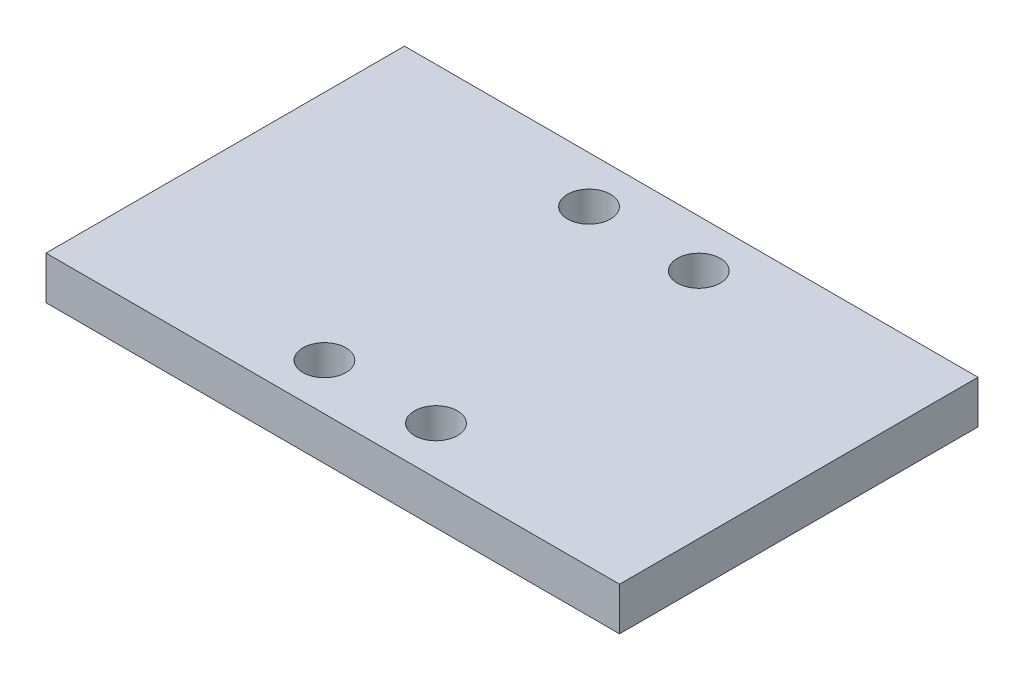
ISO-10303-21;
HEADER;
FILE_DESCRIPTION(('STEP AP214'),'2;1');
FILE_NAME('part.step','',(''),(''),'','','');
FILE_SCHEMA(('AUTOMOTIVE_DESIGN { 1 0 10303 214 1 1 1 1 }'));
ENDSEC;
DATA;
#1=APPLICATION_CONTEXT('core data for automotive mechanical design processes');
#2=APPLICATION_PROTOCOL_DEFINITION('international standard','automotive_design',2000,#1);
#3=PRODUCT_CONTEXT('',#1,'mechanical');
#4=PRODUCT('Part','Part','',(#3));
#5=PRODUCT_RELATED_PRODUCT_CATEGORY('part','',(#4));
#6=PRODUCT_DEFINITION_FORMATION('','',#4);
#7=PRODUCT_DEFINITION_CONTEXT('part definition',#1,'design');
#8=PRODUCT_DEFINITION('design','',#6,#7);
#9=PRODUCT_DEFINITION_SHAPE('','',#8);
#10=(LENGTH_UNIT() NAMED_UNIT(*) SI_UNIT(.MILLI.,.METRE.));
#11=(NAMED_UNIT(*) PLANE_ANGLE_UNIT() SI_UNIT($,.RADIAN.));
#12=(NAMED_UNIT(*) SI_UNIT($,.STERADIAN.) SOLID_ANGLE_UNIT());
#13=UNCERTAINTY_MEASURE_WITH_UNIT(LENGTH_MEASURE(1.E-05),#10,'distance_accuracy_value','');
#14=(GEOMETRIC_REPRESENTATION_CONTEXT(3) GLOBAL_UNCERTAINTY_ASSIGNED_CONTEXT((#13)) GLOBAL_UNIT_ASSIGNED_CONTEXT((#10,
#11,#12)) REPRESENTATION_CONTEXT('',''));
#15=CARTESIAN_POINT('',(0.,0.,0.));
#16=DIRECTION('',(0.,0.,1.));
#17=DIRECTION('',(1.,0.,0.));
#18=AXIS2_PLACEMENT_3D('',#15,#16,#17);
#19=CARTESIAN_POINT('',(20.,3.,12.5));
#20=DIRECTION('',(-1.,0.,0.));
#21=DIRECTION('',(0.,0.,1.));
#22=AXIS2_PLACEMENT_3D('',#19,#20,#21);
#23=PLANE('',#22);
#24=DIRECTION('',(0.,0.,-1.));
#25=VECTOR('',#24,1.);
#26=CARTESIAN_POINT('',(20.,0.,12.5));
#27=LINE('',#26,#25);
#28=CARTESIAN_POINT('',(20.,0.,12.5));
#29=VERTEX_POINT('',#28);
#30=CARTESIAN_POINT('',(20.,0.,-12.5));
#31=VERTEX_POINT('',#30);
#32=EDGE_CURVE('E107',#29,#31,#27,.T.);
#33=ORIENTED_EDGE('',*,*,#32,.T.);
#34=DIRECTION('',(0.,-1.,0.));
#35=VECTOR('',#34,1.);
#36=CARTESIAN_POINT('',(20.,3.,-12.5));
#37=LINE('',#36,#35);
#38=CARTESIAN_POINT('',(20.,3.,-12.5));
#39=VERTEX_POINT('',#38);
#40=EDGE_CURVE('E11',#39,#31,#37,.T.);
#41=ORIENTED_EDGE('',*,*,#40,.F.);
#42=DIRECTION('',(0.,0.,-1.));
#43=VECTOR('',#42,1.);
#44=CARTESIAN_POINT('',(20.,3.,12.5));
#45=LINE('',#44,#43);
#46=CARTESIAN_POINT('',(20.,3.,12.5));
#47=VERTEX_POINT('',#46);
#48=EDGE_CURVE('E95',#47,#39,#45,.T.);
#49=ORIENTED_EDGE('',*,*,#48,.F.);
#50=DIRECTION('',(0.,-1.,0.));
#51=VECTOR('',#50,1.);
#52=CARTESIAN_POINT('',(20.,3.,12.5));
#53=LINE('',#52,#51);
#54=EDGE_CURVE('E103',#47,#29,#53,.T.);
#55=ORIENTED_EDGE('',*,*,#54,.T.);
#56=EDGE_LOOP('',(#33,#41,#49,#55));
#57=FACE_BOUND('',#56,.T.);
#58=ADVANCED_FACE('F44',(#57),#23,.F.);
#59=CARTESIAN_POINT('',(-20.,3.,-12.5));
#60=DIRECTION('',(0.,0.,1.));
#61=DIRECTION('',(1.,0.,0.));
#62=AXIS2_PLACEMENT_3D('',#59,#60,#61);
#63=PLANE('',#62);
#64=DIRECTION('',(-1.,0.,0.));
#65=VECTOR('',#64,1.);
#66=CARTESIAN_POINT('',(-20.,0.,-12.5));
#67=LINE('',#66,#65);
#68=CARTESIAN_POINT('',(-20.,0.,-12.5));
#69=VERTEX_POINT('',#68);
#70=EDGE_CURVE('E99',#31,#69,#67,.T.);
#71=ORIENTED_EDGE('',*,*,#70,.T.);
#72=DIRECTION('',(0.,-1.,0.));
#73=VECTOR('',#72,1.);
#74=CARTESIAN_POINT('',(-20.,3.,-12.5));
#75=LINE('',#74,#73);
#76=CARTESIAN_POINT('',(-20.,3.,-12.5));
#77=VERTEX_POINT('',#76);
#78=EDGE_CURVE('E52',#77,#69,#75,.T.);
#79=ORIENTED_EDGE('',*,*,#78,.F.);
#80=DIRECTION('',(-1.,0.,0.));
#81=VECTOR('',#80,1.);
#82=CARTESIAN_POINT('',(-20.,3.,-12.5));
#83=LINE('',#82,#81);
#84=EDGE_CURVE('E90',#39,#77,#83,.T.);
#85=ORIENTED_EDGE('',*,*,#84,.F.);
#86=ORIENTED_EDGE('',*,*,#40,.T.);
#87=EDGE_LOOP('',(#71,#79,#85,#86));
#88=FACE_BOUND('',#87,.T.);
#89=ADVANCED_FACE('F98',(#88),#63,.F.);
#90=CARTESIAN_POINT('',(-20.,3.,12.5));
#91=DIRECTION('',(1.,0.,0.));
#92=DIRECTION('',(0.,0.,-1.));
#93=AXIS2_PLACEMENT_3D('',#90,#91,#92);
#94=PLANE('',#93);
#95=DIRECTION('',(0.,0.,1.));
#96=VECTOR('',#95,1.);
#97=CARTESIAN_POINT('',(-20.,0.,12.5));
#98=LINE('',#97,#96);
#99=CARTESIAN_POINT('',(-20.,0.,12.5));
#100=VERTEX_POINT('',#99);
#101=EDGE_CURVE('E77',#69,#100,#98,.T.);
#102=ORIENTED_EDGE('',*,*,#101,.T.);
#103=DIRECTION('',(0.,-1.,0.));
#104=VECTOR('',#103,1.);
#105=CARTESIAN_POINT('',(-20.,3.,12.5));
#106=LINE('',#105,#104);
#107=CARTESIAN_POINT('',(-20.,3.,12.5));
#108=VERTEX_POINT('',#107);
#109=EDGE_CURVE('E100',#108,#100,#106,.T.);
#110=ORIENTED_EDGE('',*,*,#109,.F.);
#111=DIRECTION('',(0.,0.,1.));
#112=VECTOR('',#111,1.);
#113=CARTESIAN_POINT('',(-20.,3.,12.5));
#114=LINE('',#113,#112);
#115=EDGE_CURVE('E93',#77,#108,#114,.T.);
#116=ORIENTED_EDGE('',*,*,#115,.F.);
#117=ORIENTED_EDGE('',*,*,#78,.T.);
#118=EDGE_LOOP('',(#102,#110,#116,#117));
#119=FACE_BOUND('',#118,.T.);
#120=ADVANCED_FACE('F101',(#119),#94,.F.);
#121=CARTESIAN_POINT('',(-20.,3.,12.5));
#122=DIRECTION('',(0.,0.,-1.));
#123=DIRECTION('',(-1.,0.,0.));
#124=AXIS2_PLACEMENT_3D('',#121,#122,#123);
#125=PLANE('',#124);
#126=DIRECTION('',(1.,0.,0.));
#127=VECTOR('',#126,1.);
#128=CARTESIAN_POINT('',(-20.,0.,12.5));
#129=LINE('',#128,#127);
#130=EDGE_CURVE('E83',#100,#29,#129,.T.);
#131=ORIENTED_EDGE('',*,*,#130,.T.);
#132=ORIENTED_EDGE('',*,*,#54,.F.);
#133=DIRECTION('',(1.,0.,0.));
#134=VECTOR('',#133,1.);
#135=CARTESIAN_POINT('',(-20.,3.,12.5));
#136=LINE('',#135,#134);
#137=EDGE_CURVE('E60',#108,#47,#136,.T.);
#138=ORIENTED_EDGE('',*,*,#137,.F.);
#139=ORIENTED_EDGE('',*,*,#109,.T.);
#140=EDGE_LOOP('',(#131,#132,#138,#139));
#141=FACE_BOUND('',#140,.T.);
#142=ADVANCED_FACE('F115',(#141),#125,.F.);
#143=CARTESIAN_POINT('',(0.,3.,0.));
#144=DIRECTION('',(0.,-1.,0.));
#145=DIRECTION('',(0.,0.,-1.));
#146=AXIS2_PLACEMENT_3D('',#143,#144,#145);
#147=PLANE('',#146);
#148=CARTESIAN_POINT('',(-3.82277866581102,3.,9.25956527934246));
#149=DIRECTION('',(0.,-1.,0.));
#150=DIRECTION('',(0.,0.,1.));
#151=AXIS2_PLACEMENT_3D('',#148,#149,#150);
#152=CIRCLE('',#151,1.5);
#153=CARTESIAN_POINT('',(-3.82277866581102,3.,10.7595652793425));
#154=VERTEX_POINT('',#153);
#155=EDGE_CURVE('E127',#154,#154,#152,.T.);
#156=ORIENTED_EDGE('',*,*,#155,.T.);
#157=EDGE_LOOP('',(#156));
#158=FACE_BOUND('',#157,.T.);
#159=CARTESIAN_POINT('',(3.87666455572309,3.,9.17789553614533));
#160=DIRECTION('',(0.,-1.,0.));
#161=DIRECTION('',(0.,0.,-1.));
#162=AXIS2_PLACEMENT_3D('',#159,#160,#161);
#163=CIRCLE('',#162,1.5);
#164=CARTESIAN_POINT('',(3.87666455572309,3.,7.67789553614533));
#165=VERTEX_POINT('',#164);
#166=EDGE_CURVE('E133',#165,#165,#163,.T.);
#167=ORIENTED_EDGE('',*,*,#166,.T.);
#168=EDGE_LOOP('',(#167));
#169=FACE_BOUND('',#168,.T.);
#170=CARTESIAN_POINT('',(3.8312810249605,3.,-9.19693319850556));
#171=DIRECTION('',(0.,-1.,0.));
#172=DIRECTION('',(0.,0.,1.));
#173=AXIS2_PLACEMENT_3D('',#170,#171,#172);
#174=CIRCLE('',#173,1.5);
#175=CARTESIAN_POINT('',(3.8312810249605,3.,-7.69693319850556));
#176=VERTEX_POINT('',#175);
#177=EDGE_CURVE('E139',#176,#176,#174,.T.);
#178=ORIENTED_EDGE('',*,*,#177,.T.);
#179=EDGE_LOOP('',(#178));
#180=FACE_BOUND('',#179,.T.);
#181=CARTESIAN_POINT('',(-3.86847168524493,3.,-9.24056885211309));
#182=DIRECTION('',(0.,-1.,0.));
#183=DIRECTION('',(0.,0.,-1.));
#184=AXIS2_PLACEMENT_3D('',#181,#182,#183);
#185=CIRCLE('',#184,1.5);
#186=CARTESIAN_POINT('',(-3.86847168524493,3.,-10.7405688521131));
#187=VERTEX_POINT('',#186);
#188=EDGE_CURVE('E110',#187,#187,#185,.T.);
#189=ORIENTED_EDGE('',*,*,#188,.T.);
#190=EDGE_LOOP('',(#189));
#191=FACE_BOUND('',#190,.T.);
#192=ORIENTED_EDGE('',*,*,#48,.T.);
#193=ORIENTED_EDGE('',*,*,#84,.T.);
#194=ORIENTED_EDGE('',*,*,#115,.T.);
#195=ORIENTED_EDGE('',*,*,#137,.T.);
#196=EDGE_LOOP('',(#192,#193,#194,#195));
#197=FACE_BOUND('',#196,.T.);
#198=ADVANCED_FACE('F91',(#158,#169,#180,#191,#197),#147,.F.);
#199=CARTESIAN_POINT('',(0.,0.,0.));
#200=DIRECTION('',(0.,-1.,0.));
#201=DIRECTION('',(0.,0.,-1.));
#202=AXIS2_PLACEMENT_3D('',#199,#200,#201);
#203=PLANE('',#202);
#204=CARTESIAN_POINT('',(-3.82277866581102,0.,9.25956527934246));
#205=DIRECTION('',(0.,-1.,0.));
#206=DIRECTION('',(0.,0.,1.));
#207=AXIS2_PLACEMENT_3D('',#204,#205,#206);
#208=CIRCLE('',#207,1.5);
#209=CARTESIAN_POINT('',(-3.82277866581102,0.,10.7595652793425));
#210=VERTEX_POINT('',#209);
#211=EDGE_CURVE('E130',#210,#210,#208,.T.);
#212=ORIENTED_EDGE('',*,*,#211,.F.);
#213=EDGE_LOOP('',(#212));
#214=FACE_BOUND('',#213,.T.);
#215=CARTESIAN_POINT('',(3.87666455572309,0.,9.17789553614533));
#216=DIRECTION('',(0.,-1.,0.));
#217=DIRECTION('',(0.,0.,-1.));
#218=AXIS2_PLACEMENT_3D('',#215,#216,#217);
#219=CIRCLE('',#218,1.5);
#220=CARTESIAN_POINT('',(3.87666455572309,0.,7.67789553614533));
#221=VERTEX_POINT('',#220);
#222=EDGE_CURVE('E136',#221,#221,#219,.T.);
#223=ORIENTED_EDGE('',*,*,#222,.F.);
#224=EDGE_LOOP('',(#223));
#225=FACE_BOUND('',#224,.T.);
#226=CARTESIAN_POINT('',(3.8312810249605,0.,-9.19693319850556));
#227=DIRECTION('',(0.,-1.,0.));
#228=DIRECTION('',(0.,0.,1.));
#229=AXIS2_PLACEMENT_3D('',#226,#227,#228);
#230=CIRCLE('',#229,1.5);
#231=CARTESIAN_POINT('',(3.8312810249605,0.,-7.69693319850556));
#232=VERTEX_POINT('',#231);
#233=EDGE_CURVE('E124',#232,#232,#230,.T.);
#234=ORIENTED_EDGE('',*,*,#233,.F.);
#235=EDGE_LOOP('',(#234));
#236=FACE_BOUND('',#235,.T.);
#237=CARTESIAN_POINT('',(-3.86847168524493,0.,-9.24056885211309));
#238=DIRECTION('',(0.,-1.,0.));
#239=DIRECTION('',(0.,0.,-1.));
#240=AXIS2_PLACEMENT_3D('',#237,#238,#239);
#241=CIRCLE('',#240,1.5);
#242=CARTESIAN_POINT('',(-3.86847168524493,0.,-10.7405688521131));
#243=VERTEX_POINT('',#242);
#244=EDGE_CURVE('E121',#243,#243,#241,.T.);
#245=ORIENTED_EDGE('',*,*,#244,.F.);
#246=EDGE_LOOP('',(#245));
#247=FACE_BOUND('',#246,.T.);
#248=ORIENTED_EDGE('',*,*,#32,.F.);
#249=ORIENTED_EDGE('',*,*,#130,.F.);
#250=ORIENTED_EDGE('',*,*,#101,.F.);
#251=ORIENTED_EDGE('',*,*,#70,.F.);
#252=EDGE_LOOP('',(#248,#249,#250,#251));
#253=FACE_BOUND('',#252,.T.);
#254=ADVANCED_FACE('F118',(#214,#225,#236,#247,#253),#203,.T.);
#255=CARTESIAN_POINT('',(-3.86847168524493,3.,-9.24056885211309));
#256=DIRECTION('',(0.,-1.,0.));
#257=DIRECTION('',(0.,0.,-1.));
#258=AXIS2_PLACEMENT_3D('',#255,#256,#257);
#259=CYLINDRICAL_SURFACE('',#258,1.5);
#260=ORIENTED_EDGE('',*,*,#188,.F.);
#261=EDGE_LOOP('',(#260));
#262=FACE_BOUND('',#261,.T.);
#263=ORIENTED_EDGE('',*,*,#244,.T.);
#264=EDGE_LOOP('',(#263));
#265=FACE_BOUND('',#264,.T.);
#266=ADVANCED_FACE('F149',(#262,#265),#259,.F.);
#267=CARTESIAN_POINT('',(3.8312810249605,3.,-9.19693319850556));
#268=DIRECTION('',(0.,-1.,0.));
#269=DIRECTION('',(0.,0.,-1.));
#270=AXIS2_PLACEMENT_3D('',#267,#268,#269);
#271=CYLINDRICAL_SURFACE('',#270,1.5);
#272=ORIENTED_EDGE('',*,*,#177,.F.);
#273=EDGE_LOOP('',(#272));
#274=FACE_BOUND('',#273,.T.);
#275=ORIENTED_EDGE('',*,*,#233,.T.);
#276=EDGE_LOOP('',(#275));
#277=FACE_BOUND('',#276,.T.);
#278=ADVANCED_FACE('F145',(#274,#277),#271,.F.);
#279=CARTESIAN_POINT('',(3.87666455572309,3.,9.17789553614533));
#280=DIRECTION('',(0.,-1.,0.));
#281=DIRECTION('',(0.,0.,-1.));
#282=AXIS2_PLACEMENT_3D('',#279,#280,#281);
#283=CYLINDRICAL_SURFACE('',#282,1.5);
#284=ORIENTED_EDGE('',*,*,#166,.F.);
#285=EDGE_LOOP('',(#284));
#286=FACE_BOUND('',#285,.T.);
#287=ORIENTED_EDGE('',*,*,#222,.T.);
#288=EDGE_LOOP('',(#287));
#289=FACE_BOUND('',#288,.T.);
#290=ADVANCED_FACE('F160',(#286,#289),#283,.F.);
#291=CARTESIAN_POINT('',(-3.82277866581102,3.,9.25956527934246));
#292=DIRECTION('',(0.,-1.,0.));
#293=DIRECTION('',(0.,0.,-1.));
#294=AXIS2_PLACEMENT_3D('',#291,#292,#293);
#295=CYLINDRICAL_SURFACE('',#294,1.5);
#296=ORIENTED_EDGE('',*,*,#155,.F.);
#297=EDGE_LOOP('',(#296));
#298=FACE_BOUND('',#297,.T.);
#299=ORIENTED_EDGE('',*,*,#211,.T.);
#300=EDGE_LOOP('',(#299));
#301=FACE_BOUND('',#300,.T.);
#302=ADVANCED_FACE('F189',(#298,#301),#295,.F.);
#303=CLOSED_SHELL('',(#58,#89,#120,#142,#198,#254,#266,#278,#290,#302));
#304=MANIFOLD_SOLID_BREP('B2',#303);
#305=ADVANCED_BREP_SHAPE_REPRESENTATION('',(#18,#304),#14);
#306=SHAPE_DEFINITION_REPRESENTATION(#9,#305);
ENDSEC;
END-ISO-10303-21;
